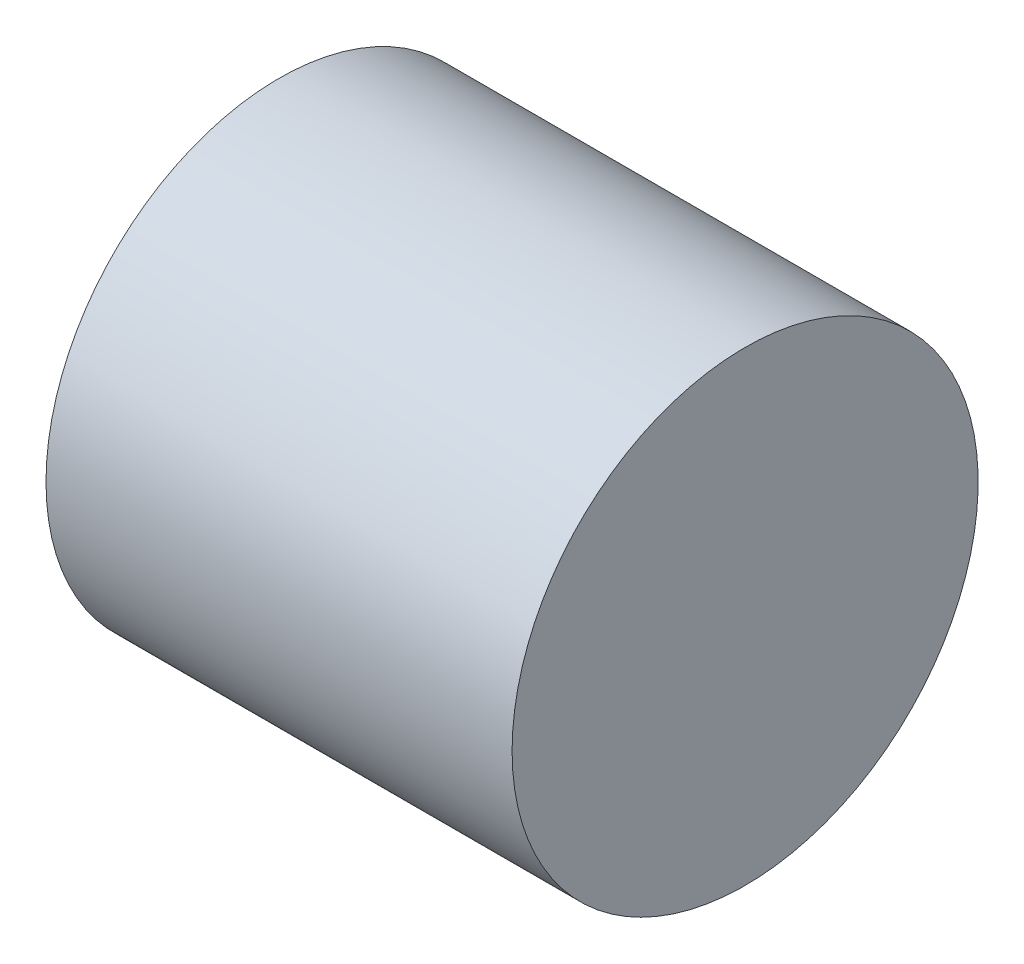
ISO-10303-21;
HEADER;
FILE_DESCRIPTION(('STEP AP214'),'2;1');
FILE_NAME('part.step','',(''),(''),'','','');
FILE_SCHEMA(('AUTOMOTIVE_DESIGN { 1 0 10303 214 1 1 1 1 }'));
ENDSEC;
DATA;
#1=APPLICATION_CONTEXT('core data for automotive mechanical design processes');
#2=APPLICATION_PROTOCOL_DEFINITION('international standard','automotive_design',2000,#1);
#3=PRODUCT_CONTEXT('',#1,'mechanical');
#4=PRODUCT('Part','Part','',(#3));
#5=PRODUCT_RELATED_PRODUCT_CATEGORY('part','',(#4));
#6=PRODUCT_DEFINITION_FORMATION('','',#4);
#7=PRODUCT_DEFINITION_CONTEXT('part definition',#1,'design');
#8=PRODUCT_DEFINITION('design','',#6,#7);
#9=PRODUCT_DEFINITION_SHAPE('','',#8);
#10=(LENGTH_UNIT() NAMED_UNIT(*) SI_UNIT(.MILLI.,.METRE.));
#11=(NAMED_UNIT(*) PLANE_ANGLE_UNIT() SI_UNIT($,.RADIAN.));
#12=(NAMED_UNIT(*) SI_UNIT($,.STERADIAN.) SOLID_ANGLE_UNIT());
#13=UNCERTAINTY_MEASURE_WITH_UNIT(LENGTH_MEASURE(1.E-05),#10,'distance_accuracy_value','');
#14=(GEOMETRIC_REPRESENTATION_CONTEXT(3) GLOBAL_UNCERTAINTY_ASSIGNED_CONTEXT((#13)) GLOBAL_UNIT_ASSIGNED_CONTEXT((#10,
#11,#12)) REPRESENTATION_CONTEXT('',''));
#15=CARTESIAN_POINT('',(0.,0.,0.));
#16=DIRECTION('',(0.,0.,1.));
#17=DIRECTION('',(1.,0.,0.));
#18=AXIS2_PLACEMENT_3D('',#15,#16,#17);
#19=CARTESIAN_POINT('',(45.,0.,0.));
#20=DIRECTION('',(-1.,0.,0.));
#21=DIRECTION('',(0.,0.,1.));
#22=AXIS2_PLACEMENT_3D('',#19,#20,#21);
#23=CYLINDRICAL_SURFACE('',#22,45.);
#24=CARTESIAN_POINT('',(45.,0.,0.));
#25=DIRECTION('',(1.,0.,0.));
#26=DIRECTION('',(0.,0.,-1.));
#27=AXIS2_PLACEMENT_3D('',#24,#25,#26);
#28=CIRCLE('',#27,45.);
#29=CARTESIAN_POINT('',(45.,0.,45.));
#30=VERTEX_POINT('',#29);
#31=EDGE_CURVE('E10',#30,#30,#28,.T.);
#32=CARTESIAN_POINT('',(-45.,0.,0.));
#33=DIRECTION('',(1.,0.,0.));
#34=DIRECTION('',(0.,0.,-1.));
#35=AXIS2_PLACEMENT_3D('',#32,#33,#34);
#36=CIRCLE('',#35,45.);
#37=CARTESIAN_POINT('',(-45.,0.,45.));
#38=VERTEX_POINT('',#37);
#39=EDGE_CURVE('E40',#38,#38,#36,.T.);
#40=CARTESIAN_POINT('',(45.,0.,45.));
#41=CARTESIAN_POINT('',(44.0625,0.,45.));
#42=CARTESIAN_POINT('',(43.125,0.,45.));
#43=CARTESIAN_POINT('',(41.25,0.,45.));
#44=CARTESIAN_POINT('',(40.3125,0.,45.));
#45=CARTESIAN_POINT('',(38.4375,0.,45.));
#46=CARTESIAN_POINT('',(37.5,0.,45.));
#47=CARTESIAN_POINT('',(35.625,0.,45.));
#48=CARTESIAN_POINT('',(34.6875,0.,45.));
#49=CARTESIAN_POINT('',(32.8125,0.,45.));
#50=CARTESIAN_POINT('',(31.875,0.,45.));
#51=CARTESIAN_POINT('',(30.,0.,45.));
#52=CARTESIAN_POINT('',(29.0625,0.,45.));
#53=CARTESIAN_POINT('',(27.1875,0.,45.));
#54=CARTESIAN_POINT('',(26.25,0.,45.));
#55=CARTESIAN_POINT('',(24.375,0.,45.));
#56=CARTESIAN_POINT('',(23.4375,0.,45.));
#57=CARTESIAN_POINT('',(21.5625,0.,45.));
#58=CARTESIAN_POINT('',(20.625,0.,45.));
#59=CARTESIAN_POINT('',(18.75,0.,45.));
#60=CARTESIAN_POINT('',(17.8125,0.,45.));
#61=CARTESIAN_POINT('',(15.9375,0.,45.));
#62=CARTESIAN_POINT('',(15.,0.,45.));
#63=CARTESIAN_POINT('',(13.125,0.,45.));
#64=CARTESIAN_POINT('',(12.1875,0.,45.));
#65=CARTESIAN_POINT('',(10.3125,0.,45.));
#66=CARTESIAN_POINT('',(9.37499999999999,0.,45.));
#67=CARTESIAN_POINT('',(7.5,0.,45.));
#68=CARTESIAN_POINT('',(6.5625,0.,45.));
#69=CARTESIAN_POINT('',(4.6875,0.,45.));
#70=CARTESIAN_POINT('',(3.75,0.,45.));
#71=CARTESIAN_POINT('',(1.87499999999999,0.,45.));
#72=CARTESIAN_POINT('',(0.937499999999994,0.,45.));
#73=CARTESIAN_POINT('',(-0.937500000000008,0.,45.));
#74=CARTESIAN_POINT('',(-1.87500000000001,0.,45.));
#75=CARTESIAN_POINT('',(-3.75000000000001,0.,45.));
#76=CARTESIAN_POINT('',(-4.68750000000001,0.,45.));
#77=CARTESIAN_POINT('',(-6.56250000000001,0.,45.));
#78=CARTESIAN_POINT('',(-7.50000000000001,0.,45.));
#79=CARTESIAN_POINT('',(-9.37500000000001,0.,45.));
#80=CARTESIAN_POINT('',(-10.3125,0.,45.));
#81=CARTESIAN_POINT('',(-12.1875,0.,45.));
#82=CARTESIAN_POINT('',(-13.125,0.,45.));
#83=CARTESIAN_POINT('',(-15.,0.,45.));
#84=CARTESIAN_POINT('',(-15.9375,0.,45.));
#85=CARTESIAN_POINT('',(-17.8125,0.,45.));
#86=CARTESIAN_POINT('',(-18.75,0.,45.));
#87=CARTESIAN_POINT('',(-20.625,0.,45.));
#88=CARTESIAN_POINT('',(-21.5625,0.,45.));
#89=CARTESIAN_POINT('',(-23.4375,0.,45.));
#90=CARTESIAN_POINT('',(-24.375,0.,45.));
#91=CARTESIAN_POINT('',(-26.25,0.,45.));
#92=CARTESIAN_POINT('',(-27.1875,0.,45.));
#93=CARTESIAN_POINT('',(-29.0625,0.,45.));
#94=CARTESIAN_POINT('',(-30.,0.,45.));
#95=CARTESIAN_POINT('',(-31.875,0.,45.));
#96=CARTESIAN_POINT('',(-32.8125,0.,45.));
#97=CARTESIAN_POINT('',(-34.6875,0.,45.));
#98=CARTESIAN_POINT('',(-35.625,0.,45.));
#99=CARTESIAN_POINT('',(-37.5,0.,45.));
#100=CARTESIAN_POINT('',(-38.4375,0.,45.));
#101=CARTESIAN_POINT('',(-40.3125,0.,45.));
#102=CARTESIAN_POINT('',(-41.25,0.,45.));
#103=CARTESIAN_POINT('',(-43.125,0.,45.));
#104=CARTESIAN_POINT('',(-44.0625,0.,45.));
#105=CARTESIAN_POINT('',(-45.,0.,45.));
#106=B_SPLINE_CURVE_WITH_KNOTS('',3,(#40,#41,#42,#43,#44,#45,#46,#47,#48,#49,#50,#51,#52,#53,
#54,#55,#56,#57,#58,#59,#60,#61,#62,#63,#64,#65,#66,#67,#68,#69,#70,#71,#72,#73,#74,#75,#76,#77,
#78,#79,#80,#81,#82,#83,#84,#85,#86,#87,#88,#89,#90,#91,#92,#93,#94,#95,#96,#97,#98,#99,#100,
#101,#102,#103,#104,#105),.UNSPECIFIED.,.F.,.F.,(4,2,2,2,2,2,2,2,2,2,2,2,2,2,2,2,2,2,2,2,2,2,2,
2,2,2,2,2,2,2,2,2,4),(0.,2.8125,5.62500000000001,8.4375,11.25,14.0625,16.875,19.6875,22.5,
25.3125,28.125,30.9375,33.75,36.5625,39.375,42.1875,45.,47.8125,50.625,53.4375,56.25,59.0625,
61.875,64.6875,67.5,70.3125,73.125,75.9375,78.75,81.5625,84.375,87.1875,90.),.UNSPECIFIED.);
#107=EDGE_CURVE('BSEAM37',#30,#38,#106,.T.);
#108=ORIENTED_EDGE('',*,*,#31,.F.);
#109=ORIENTED_EDGE('',*,*,#39,.T.);
#110=ORIENTED_EDGE('',*,*,#107,.T.);
#111=ORIENTED_EDGE('',*,*,#107,.F.);
#112=EDGE_LOOP('',(#108,#110,#109,#111));
#113=FACE_BOUND('',#112,.T.);
#114=ADVANCED_FACE('F37',(#113),#23,.T.);
#115=CARTESIAN_POINT('',(45.,0.,0.));
#116=DIRECTION('',(1.,0.,0.));
#117=DIRECTION('',(0.,0.,-1.));
#118=AXIS2_PLACEMENT_3D('',#115,#116,#117);
#119=PLANE('',#118);
#120=ORIENTED_EDGE('',*,*,#31,.T.);
#121=EDGE_LOOP('',(#120));
#122=FACE_BOUND('',#121,.T.);
#123=ADVANCED_FACE('F54',(#122),#119,.T.);
#124=CARTESIAN_POINT('',(-45.,0.,0.));
#125=DIRECTION('',(1.,0.,0.));
#126=DIRECTION('',(0.,0.,-1.));
#127=AXIS2_PLACEMENT_3D('',#124,#125,#126);
#128=PLANE('',#127);
#129=ORIENTED_EDGE('',*,*,#39,.F.);
#130=EDGE_LOOP('',(#129));
#131=FACE_BOUND('',#130,.T.);
#132=ADVANCED_FACE('F52',(#131),#128,.F.);
#133=CLOSED_SHELL('',(#114,#123,#132));
#134=MANIFOLD_SOLID_BREP('B2',#133);
#135=ADVANCED_BREP_SHAPE_REPRESENTATION('',(#18,#134),#14);
#136=SHAPE_DEFINITION_REPRESENTATION(#9,#135);
ENDSEC;
END-ISO-10303-21;
